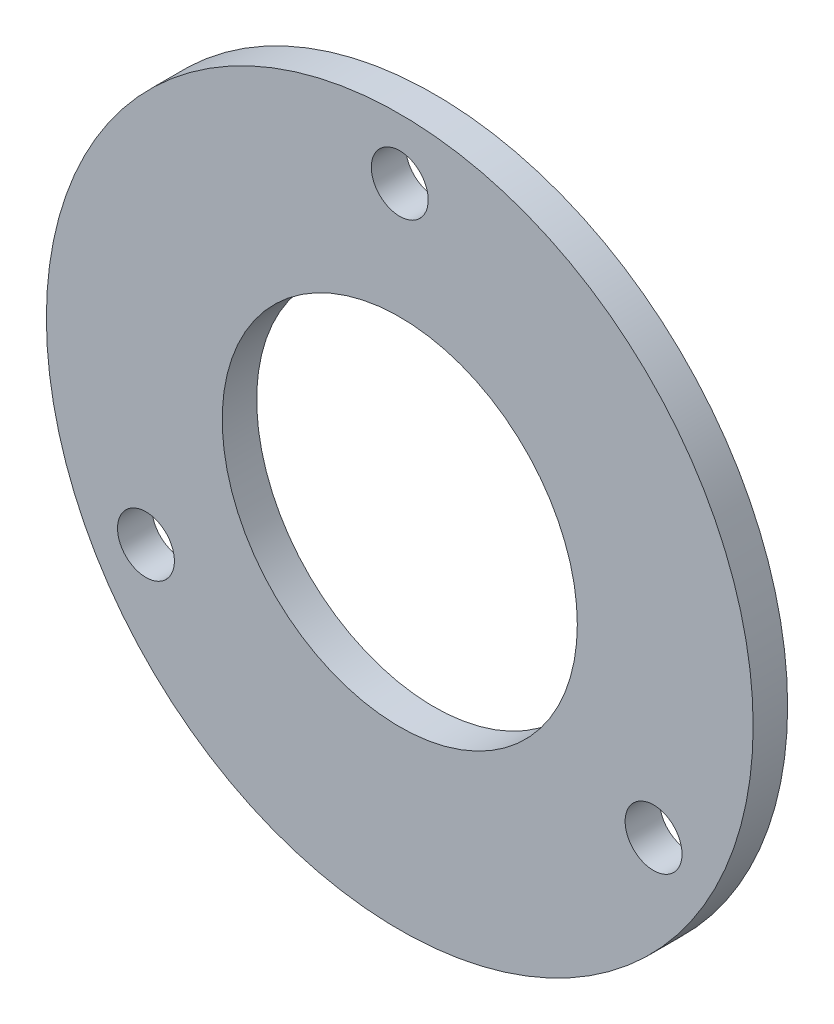
ISO-10303-21;
HEADER;
FILE_DESCRIPTION(('STEP AP214'),'2;1');
FILE_NAME('part.step','',(''),(''),'','','');
FILE_SCHEMA(('AUTOMOTIVE_DESIGN { 1 0 10303 214 1 1 1 1 }'));
ENDSEC;
DATA;
#1=APPLICATION_CONTEXT('core data for automotive mechanical design processes');
#2=APPLICATION_PROTOCOL_DEFINITION('international standard','automotive_design',2000,#1);
#3=PRODUCT_CONTEXT('',#1,'mechanical');
#4=PRODUCT('Part','Part','',(#3));
#5=PRODUCT_RELATED_PRODUCT_CATEGORY('part','',(#4));
#6=PRODUCT_DEFINITION_FORMATION('','',#4);
#7=PRODUCT_DEFINITION_CONTEXT('part definition',#1,'design');
#8=PRODUCT_DEFINITION('design','',#6,#7);
#9=PRODUCT_DEFINITION_SHAPE('','',#8);
#10=(LENGTH_UNIT() NAMED_UNIT(*) SI_UNIT(.MILLI.,.METRE.));
#11=(NAMED_UNIT(*) PLANE_ANGLE_UNIT() SI_UNIT($,.RADIAN.));
#12=(NAMED_UNIT(*) SI_UNIT($,.STERADIAN.) SOLID_ANGLE_UNIT());
#13=UNCERTAINTY_MEASURE_WITH_UNIT(LENGTH_MEASURE(1.E-05),#10,'distance_accuracy_value','');
#14=(GEOMETRIC_REPRESENTATION_CONTEXT(3) GLOBAL_UNCERTAINTY_ASSIGNED_CONTEXT((#13)) GLOBAL_UNIT_ASSIGNED_CONTEXT((#10,
#11,#12)) REPRESENTATION_CONTEXT('',''));
#15=CARTESIAN_POINT('',(0.,0.,0.));
#16=DIRECTION('',(0.,0.,1.));
#17=DIRECTION('',(1.,0.,0.));
#18=AXIS2_PLACEMENT_3D('',#15,#16,#17);
#19=CARTESIAN_POINT('',(0.,0.,2.));
#20=DIRECTION('',(0.,0.,1.));
#21=DIRECTION('',(1.,0.,0.));
#22=AXIS2_PLACEMENT_3D('',#19,#20,#21);
#23=PLANE('',#22);
#24=CARTESIAN_POINT('',(-14.7224318643355,-8.5,2.));
#25=DIRECTION('',(0.,0.,1.));
#26=DIRECTION('',(1.,0.,0.));
#27=AXIS2_PLACEMENT_3D('',#24,#25,#26);
#28=CIRCLE('',#27,1.65);
#29=CARTESIAN_POINT('',(-13.0724318643355,-8.5,2.));
#30=VERTEX_POINT('',#29);
#31=EDGE_CURVE('E63',#30,#30,#28,.T.);
#32=ORIENTED_EDGE('',*,*,#31,.F.);
#33=EDGE_LOOP('',(#32));
#34=FACE_BOUND('',#33,.T.);
#35=CARTESIAN_POINT('',(0.,0.,2.));
#36=DIRECTION('',(0.,0.,1.));
#37=DIRECTION('',(1.,0.,0.));
#38=AXIS2_PLACEMENT_3D('',#35,#36,#37);
#39=CIRCLE('',#38,10.3);
#40=CARTESIAN_POINT('',(10.3,0.,2.));
#41=VERTEX_POINT('',#40);
#42=EDGE_CURVE('E52',#41,#41,#39,.T.);
#43=ORIENTED_EDGE('',*,*,#42,.F.);
#44=EDGE_LOOP('',(#43));
#45=FACE_BOUND('',#44,.T.);
#46=CARTESIAN_POINT('',(0.,0.,2.));
#47=DIRECTION('',(0.,0.,1.));
#48=DIRECTION('',(1.,0.,0.));
#49=AXIS2_PLACEMENT_3D('',#46,#47,#48);
#50=CIRCLE('',#49,20.5);
#51=CARTESIAN_POINT('',(20.5,0.,2.));
#52=VERTEX_POINT('',#51);
#53=EDGE_CURVE('E10',#52,#52,#50,.T.);
#54=ORIENTED_EDGE('',*,*,#53,.T.);
#55=EDGE_LOOP('',(#54));
#56=FACE_BOUND('',#55,.T.);
#57=CARTESIAN_POINT('',(0.,17.,2.));
#58=DIRECTION('',(0.,0.,1.));
#59=DIRECTION('',(1.,0.,0.));
#60=AXIS2_PLACEMENT_3D('',#57,#58,#59);
#61=CIRCLE('',#60,1.65);
#62=CARTESIAN_POINT('',(1.65,17.,2.));
#63=VERTEX_POINT('',#62);
#64=EDGE_CURVE('E57',#63,#63,#61,.T.);
#65=ORIENTED_EDGE('',*,*,#64,.F.);
#66=EDGE_LOOP('',(#65));
#67=FACE_BOUND('',#66,.T.);
#68=CARTESIAN_POINT('',(14.7224318643355,-8.50000000000001,2.));
#69=DIRECTION('',(0.,0.,1.));
#70=DIRECTION('',(1.,0.,0.));
#71=AXIS2_PLACEMENT_3D('',#68,#69,#70);
#72=CIRCLE('',#71,1.65);
#73=CARTESIAN_POINT('',(16.3724318643355,-8.50000000000001,2.));
#74=VERTEX_POINT('',#73);
#75=EDGE_CURVE('E69',#74,#74,#72,.T.);
#76=ORIENTED_EDGE('',*,*,#75,.F.);
#77=EDGE_LOOP('',(#76));
#78=FACE_BOUND('',#77,.T.);
#79=ADVANCED_FACE('F41',(#34,#45,#56,#67,#78),#23,.T.);
#80=CARTESIAN_POINT('',(0.,0.,0.));
#81=DIRECTION('',(0.,0.,1.));
#82=DIRECTION('',(1.,0.,0.));
#83=AXIS2_PLACEMENT_3D('',#80,#81,#82);
#84=PLANE('',#83);
#85=CARTESIAN_POINT('',(0.,0.,0.));
#86=DIRECTION('',(0.,0.,1.));
#87=DIRECTION('',(1.,0.,0.));
#88=AXIS2_PLACEMENT_3D('',#85,#86,#87);
#89=CIRCLE('',#88,20.5);
#90=CARTESIAN_POINT('',(20.5,0.,0.));
#91=VERTEX_POINT('',#90);
#92=EDGE_CURVE('E45',#91,#91,#89,.T.);
#93=ORIENTED_EDGE('',*,*,#92,.F.);
#94=EDGE_LOOP('',(#93));
#95=FACE_BOUND('',#94,.T.);
#96=CARTESIAN_POINT('',(0.,0.,0.));
#97=DIRECTION('',(0.,0.,1.));
#98=DIRECTION('',(1.,0.,0.));
#99=AXIS2_PLACEMENT_3D('',#96,#97,#98);
#100=CIRCLE('',#99,10.3);
#101=CARTESIAN_POINT('',(10.3,0.,0.));
#102=VERTEX_POINT('',#101);
#103=EDGE_CURVE('E54',#102,#102,#100,.T.);
#104=ORIENTED_EDGE('',*,*,#103,.T.);
#105=EDGE_LOOP('',(#104));
#106=FACE_BOUND('',#105,.T.);
#107=CARTESIAN_POINT('',(0.,17.,0.));
#108=DIRECTION('',(0.,0.,1.));
#109=DIRECTION('',(1.,0.,0.));
#110=AXIS2_PLACEMENT_3D('',#107,#108,#109);
#111=CIRCLE('',#110,1.65);
#112=CARTESIAN_POINT('',(1.65,17.,0.));
#113=VERTEX_POINT('',#112);
#114=EDGE_CURVE('E60',#113,#113,#111,.T.);
#115=ORIENTED_EDGE('',*,*,#114,.T.);
#116=EDGE_LOOP('',(#115));
#117=FACE_BOUND('',#116,.T.);
#118=CARTESIAN_POINT('',(-14.7224318643355,-8.5,0.));
#119=DIRECTION('',(0.,0.,1.));
#120=DIRECTION('',(1.,0.,0.));
#121=AXIS2_PLACEMENT_3D('',#118,#119,#120);
#122=CIRCLE('',#121,1.65);
#123=CARTESIAN_POINT('',(-13.0724318643355,-8.5,0.));
#124=VERTEX_POINT('',#123);
#125=EDGE_CURVE('E66',#124,#124,#122,.T.);
#126=ORIENTED_EDGE('',*,*,#125,.T.);
#127=EDGE_LOOP('',(#126));
#128=FACE_BOUND('',#127,.T.);
#129=CARTESIAN_POINT('',(14.7224318643355,-8.50000000000001,0.));
#130=DIRECTION('',(0.,0.,1.));
#131=DIRECTION('',(1.,0.,0.));
#132=AXIS2_PLACEMENT_3D('',#129,#130,#131);
#133=CIRCLE('',#132,1.65);
#134=CARTESIAN_POINT('',(16.3724318643355,-8.50000000000001,0.));
#135=VERTEX_POINT('',#134);
#136=EDGE_CURVE('E72',#135,#135,#133,.T.);
#137=ORIENTED_EDGE('',*,*,#136,.T.);
#138=EDGE_LOOP('',(#137));
#139=FACE_BOUND('',#138,.T.);
#140=ADVANCED_FACE('F82',(#95,#106,#117,#128,#139),#84,.F.);
#141=CARTESIAN_POINT('',(0.,0.,2.));
#142=DIRECTION('',(0.,0.,-1.));
#143=DIRECTION('',(-1.,0.,0.));
#144=AXIS2_PLACEMENT_3D('',#141,#142,#143);
#145=CYLINDRICAL_SURFACE('',#144,20.5);
#146=ORIENTED_EDGE('',*,*,#53,.F.);
#147=EDGE_LOOP('',(#146));
#148=FACE_BOUND('',#147,.T.);
#149=ORIENTED_EDGE('',*,*,#92,.T.);
#150=EDGE_LOOP('',(#149));
#151=FACE_BOUND('',#150,.T.);
#152=ADVANCED_FACE('F43',(#148,#151),#145,.T.);
#153=CARTESIAN_POINT('',(0.,0.,2.));
#154=DIRECTION('',(0.,0.,-1.));
#155=DIRECTION('',(-1.,0.,0.));
#156=AXIS2_PLACEMENT_3D('',#153,#154,#155);
#157=CYLINDRICAL_SURFACE('',#156,10.3);
#158=ORIENTED_EDGE('',*,*,#42,.T.);
#159=EDGE_LOOP('',(#158));
#160=FACE_BOUND('',#159,.T.);
#161=ORIENTED_EDGE('',*,*,#103,.F.);
#162=EDGE_LOOP('',(#161));
#163=FACE_BOUND('',#162,.T.);
#164=ADVANCED_FACE('F92',(#160,#163),#157,.F.);
#165=CARTESIAN_POINT('',(0.,17.,2.));
#166=DIRECTION('',(0.,0.,-1.));
#167=DIRECTION('',(-1.,0.,0.));
#168=AXIS2_PLACEMENT_3D('',#165,#166,#167);
#169=CYLINDRICAL_SURFACE('',#168,1.65);
#170=ORIENTED_EDGE('',*,*,#64,.T.);
#171=EDGE_LOOP('',(#170));
#172=FACE_BOUND('',#171,.T.);
#173=ORIENTED_EDGE('',*,*,#114,.F.);
#174=EDGE_LOOP('',(#173));
#175=FACE_BOUND('',#174,.T.);
#176=ADVANCED_FACE('F95',(#172,#175),#169,.F.);
#177=CARTESIAN_POINT('',(-14.7224318643355,-8.5,2.));
#178=DIRECTION('',(0.,0.,-1.));
#179=DIRECTION('',(-1.,0.,0.));
#180=AXIS2_PLACEMENT_3D('',#177,#178,#179);
#181=CYLINDRICAL_SURFACE('',#180,1.65);
#182=ORIENTED_EDGE('',*,*,#31,.T.);
#183=EDGE_LOOP('',(#182));
#184=FACE_BOUND('',#183,.T.);
#185=ORIENTED_EDGE('',*,*,#125,.F.);
#186=EDGE_LOOP('',(#185));
#187=FACE_BOUND('',#186,.T.);
#188=ADVANCED_FACE('F99',(#184,#187),#181,.F.);
#189=CARTESIAN_POINT('',(14.7224318643355,-8.50000000000001,2.));
#190=DIRECTION('',(0.,0.,-1.));
#191=DIRECTION('',(-1.,0.,0.));
#192=AXIS2_PLACEMENT_3D('',#189,#190,#191);
#193=CYLINDRICAL_SURFACE('',#192,1.65);
#194=ORIENTED_EDGE('',*,*,#75,.T.);
#195=EDGE_LOOP('',(#194));
#196=FACE_BOUND('',#195,.T.);
#197=ORIENTED_EDGE('',*,*,#136,.F.);
#198=EDGE_LOOP('',(#197));
#199=FACE_BOUND('',#198,.T.);
#200=ADVANCED_FACE('F78',(#196,#199),#193,.F.);
#201=CLOSED_SHELL('',(#79,#140,#152,#164,#176,#188,#200));
#202=MANIFOLD_SOLID_BREP('B2',#201);
#203=ADVANCED_BREP_SHAPE_REPRESENTATION('',(#18,#202),#14);
#204=SHAPE_DEFINITION_REPRESENTATION(#9,#203);
ENDSEC;
END-ISO-10303-21;
